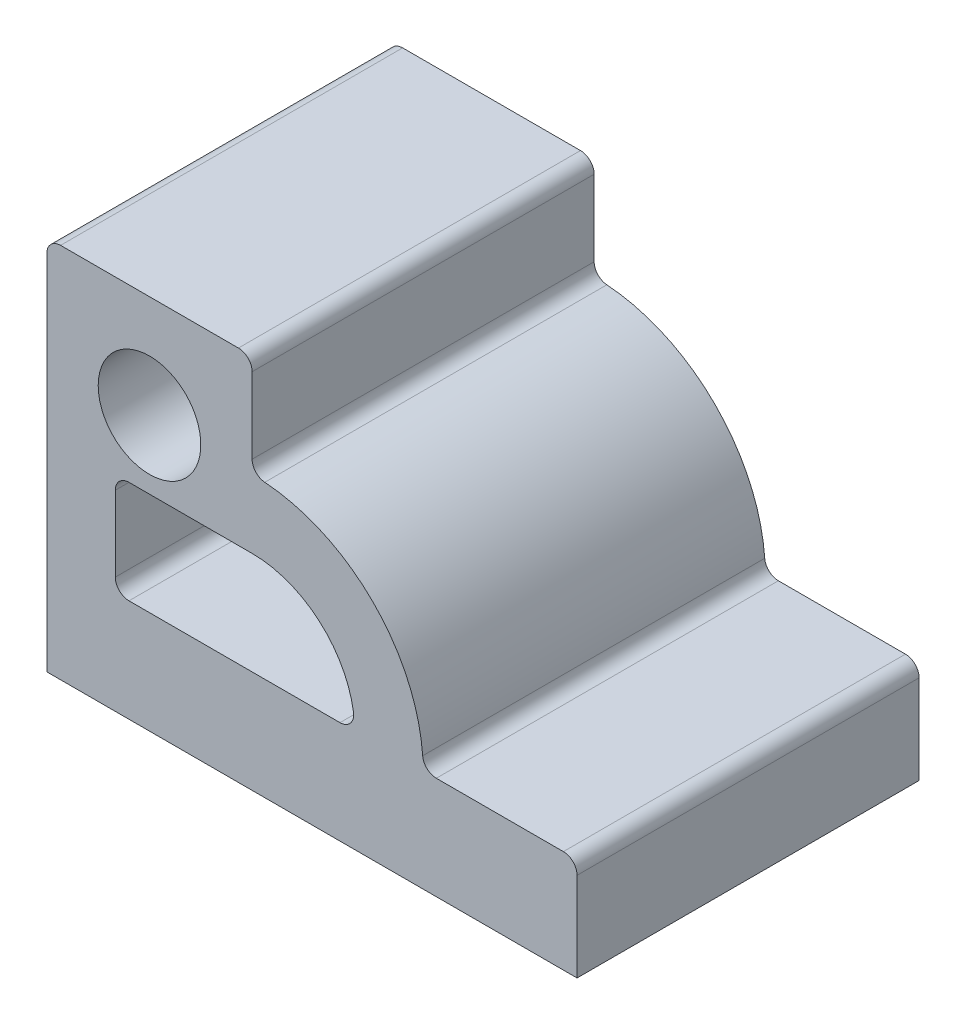
ISO-10303-21;
HEADER;
FILE_DESCRIPTION(('STEP AP214'),'2;1');
FILE_NAME('part.step','',(''),(''),'','','');
FILE_SCHEMA(('AUTOMOTIVE_DESIGN { 1 0 10303 214 1 1 1 1 }'));
ENDSEC;
DATA;
#1=APPLICATION_CONTEXT('core data for automotive mechanical design processes');
#2=APPLICATION_PROTOCOL_DEFINITION('international standard','automotive_design',2000,#1);
#3=PRODUCT_CONTEXT('',#1,'mechanical');
#4=PRODUCT('Part','Part','',(#3));
#5=PRODUCT_RELATED_PRODUCT_CATEGORY('part','',(#4));
#6=PRODUCT_DEFINITION_FORMATION('','',#4);
#7=PRODUCT_DEFINITION_CONTEXT('part definition',#1,'design');
#8=PRODUCT_DEFINITION('design','',#6,#7);
#9=PRODUCT_DEFINITION_SHAPE('','',#8);
#10=(LENGTH_UNIT() NAMED_UNIT(*) SI_UNIT(.MILLI.,.METRE.));
#11=(NAMED_UNIT(*) PLANE_ANGLE_UNIT() SI_UNIT($,.RADIAN.));
#12=(NAMED_UNIT(*) SI_UNIT($,.STERADIAN.) SOLID_ANGLE_UNIT());
#13=UNCERTAINTY_MEASURE_WITH_UNIT(LENGTH_MEASURE(1.E-05),#10,'distance_accuracy_value','');
#14=(GEOMETRIC_REPRESENTATION_CONTEXT(3) GLOBAL_UNCERTAINTY_ASSIGNED_CONTEXT((#13)) GLOBAL_UNIT_ASSIGNED_CONTEXT((#10,
#11,#12)) REPRESENTATION_CONTEXT('',''));
#15=CARTESIAN_POINT('',(0.,0.,0.));
#16=DIRECTION('',(0.,0.,1.));
#17=DIRECTION('',(1.,0.,0.));
#18=AXIS2_PLACEMENT_3D('',#15,#16,#17);
#19=CARTESIAN_POINT('',(-80.8657024793388,106.,100.));
#20=DIRECTION('',(0.,0.,-1.));
#21=DIRECTION('',(-1.,0.,0.));
#22=AXIS2_PLACEMENT_3D('',#19,#20,#21);
#23=PLANE('',#22);
#24=DIRECTION('',(0.,1.,0.));
#25=VECTOR('',#24,1.);
#26=CARTESIAN_POINT('',(70.1342975206612,26.,100.));
#27=LINE('',#26,#25);
#28=CARTESIAN_POINT('',(70.1342975206612,0.,100.));
#29=VERTEX_POINT('',#28);
#30=CARTESIAN_POINT('',(70.1342975206612,26.,100.));
#31=VERTEX_POINT('',#30);
#32=EDGE_CURVE('E229',#29,#31,#27,.T.);
#33=ORIENTED_EDGE('',*,*,#32,.T.);
#34=CARTESIAN_POINT('',(66.1342975206612,26.,100.));
#35=DIRECTION('',(0.,0.,1.));
#36=DIRECTION('',(-1.,0.,0.));
#37=AXIS2_PLACEMENT_3D('',#34,#35,#36);
#38=CIRCLE('',#37,4.);
#39=CARTESIAN_POINT('',(66.1342975206611,30.,100.));
#40=VERTEX_POINT('',#39);
#41=EDGE_CURVE('E232',#31,#40,#38,.T.);
#42=ORIENTED_EDGE('',*,*,#41,.T.);
#43=DIRECTION('',(-1.,0.,0.));
#44=VECTOR('',#43,1.);
#45=CARTESIAN_POINT('',(28.9859455920062,30.,100.));
#46=LINE('',#45,#44);
#47=CARTESIAN_POINT('',(28.9859455920062,30.,100.));
#48=VERTEX_POINT('',#47);
#49=EDGE_CURVE('E235',#40,#48,#46,.T.);
#50=ORIENTED_EDGE('',*,*,#49,.T.);
#51=CARTESIAN_POINT('',(28.9859455920062,34.,100.));
#52=DIRECTION('',(0.,0.,-1.));
#53=DIRECTION('',(1.,0.,0.));
#54=AXIS2_PLACEMENT_3D('',#51,#52,#53);
#55=CIRCLE('',#54,4.00000000000001);
#56=CARTESIAN_POINT('',(24.9969346237584,33.7037037037037,100.));
#57=VERTEX_POINT('',#56);
#58=EDGE_CURVE('E237',#48,#57,#55,.T.);
#59=ORIENTED_EDGE('',*,*,#58,.T.);
#60=CARTESIAN_POINT('',(-24.8657024793388,30.,100.));
#61=DIRECTION('',(0.,0.,1.));
#62=DIRECTION('',(-1.,0.,0.));
#63=AXIS2_PLACEMENT_3D('',#60,#61,#62);
#64=CIRCLE('',#63,50.);
#65=CARTESIAN_POINT('',(-21.1619987756351,79.8626371030973,100.));
#66=VERTEX_POINT('',#65);
#67=EDGE_CURVE('E239',#57,#66,#64,.T.);
#68=ORIENTED_EDGE('',*,*,#67,.T.);
#69=CARTESIAN_POINT('',(-20.8657024793388,83.851648071345,100.));
#70=DIRECTION('',(0.,0.,-1.));
#71=DIRECTION('',(1.,0.,0.));
#72=AXIS2_PLACEMENT_3D('',#69,#70,#71);
#73=CIRCLE('',#72,4.);
#74=CARTESIAN_POINT('',(-24.8657024793388,83.851648071345,100.));
#75=VERTEX_POINT('',#74);
#76=EDGE_CURVE('E241',#66,#75,#73,.T.);
#77=ORIENTED_EDGE('',*,*,#76,.T.);
#78=DIRECTION('',(0.,1.,0.));
#79=VECTOR('',#78,1.);
#80=CARTESIAN_POINT('',(-24.8657024793388,106.,100.));
#81=LINE('',#80,#79);
#82=CARTESIAN_POINT('',(-24.8657024793388,106.,100.));
#83=VERTEX_POINT('',#82);
#84=EDGE_CURVE('E243',#75,#83,#81,.T.);
#85=ORIENTED_EDGE('',*,*,#84,.T.);
#86=CARTESIAN_POINT('',(-28.8657024793388,106.,100.));
#87=DIRECTION('',(0.,0.,1.));
#88=DIRECTION('',(-1.,0.,0.));
#89=AXIS2_PLACEMENT_3D('',#86,#87,#88);
#90=CIRCLE('',#89,4.);
#91=CARTESIAN_POINT('',(-28.8657024793389,110.,100.));
#92=VERTEX_POINT('',#91);
#93=EDGE_CURVE('E245',#83,#92,#90,.T.);
#94=ORIENTED_EDGE('',*,*,#93,.T.);
#95=DIRECTION('',(-1.,0.,0.));
#96=VECTOR('',#95,1.);
#97=CARTESIAN_POINT('',(-80.8657024793388,110.,100.));
#98=LINE('',#97,#96);
#99=CARTESIAN_POINT('',(-80.8657024793388,110.,100.));
#100=VERTEX_POINT('',#99);
#101=EDGE_CURVE('E247',#92,#100,#98,.T.);
#102=ORIENTED_EDGE('',*,*,#101,.T.);
#103=CARTESIAN_POINT('',(-80.8657024793388,106.,100.));
#104=DIRECTION('',(0.,0.,1.));
#105=DIRECTION('',(-1.,0.,0.));
#106=AXIS2_PLACEMENT_3D('',#103,#104,#105);
#107=CIRCLE('',#106,4.);
#108=CARTESIAN_POINT('',(-84.8657024793388,106.,100.));
#109=VERTEX_POINT('',#108);
#110=EDGE_CURVE('E249',#100,#109,#107,.T.);
#111=ORIENTED_EDGE('',*,*,#110,.T.);
#112=DIRECTION('',(0.,-1.,0.));
#113=VECTOR('',#112,1.);
#114=CARTESIAN_POINT('',(-84.8657024793388,0.,100.));
#115=LINE('',#114,#113);
#116=CARTESIAN_POINT('',(-84.8657024793388,0.,100.));
#117=VERTEX_POINT('',#116);
#118=EDGE_CURVE('E251',#109,#117,#115,.T.);
#119=ORIENTED_EDGE('',*,*,#118,.T.);
#120=DIRECTION('',(1.,0.,0.));
#121=VECTOR('',#120,1.);
#122=CARTESIAN_POINT('',(70.1342975206612,0.,100.));
#123=LINE('',#122,#121);
#124=EDGE_CURVE('E253',#117,#29,#123,.T.);
#125=ORIENTED_EDGE('',*,*,#124,.T.);
#126=EDGE_LOOP('',(#33,#42,#50,#59,#68,#77,#85,#94,#102,#111,#119,#125));
#127=FACE_BOUND('',#126,.T.);
#128=CARTESIAN_POINT('',(-24.8657024793388,30.,100.));
#129=DIRECTION('',(0.,0.,1.));
#130=DIRECTION('',(-1.,0.,0.));
#131=AXIS2_PLACEMENT_3D('',#128,#129,#130);
#132=CIRCLE('',#131,30.);
#133=CARTESIAN_POINT('',(4.77714193296532,34.6153846153846,100.));
#134=VERTEX_POINT('',#133);
#135=CARTESIAN_POINT('',(-24.8657024793388,60.,100.));
#136=VERTEX_POINT('',#135);
#137=EDGE_CURVE('E168',#134,#136,#132,.T.);
#138=ORIENTED_EDGE('',*,*,#137,.F.);
#139=CARTESIAN_POINT('',(0.82476267799144,34.,100.));
#140=DIRECTION('',(0.,0.,1.));
#141=DIRECTION('',(1.,0.,0.));
#142=AXIS2_PLACEMENT_3D('',#139,#140,#141);
#143=CIRCLE('',#142,4.);
#144=CARTESIAN_POINT('',(0.824762677991441,30.,100.));
#145=VERTEX_POINT('',#144);
#146=EDGE_CURVE('E201',#145,#134,#143,.T.);
#147=ORIENTED_EDGE('',*,*,#146,.F.);
#148=DIRECTION('',(1.,0.,0.));
#149=VECTOR('',#148,1.);
#150=CARTESIAN_POINT('',(0.824762677991441,30.,100.));
#151=LINE('',#150,#149);
#152=CARTESIAN_POINT('',(-60.8657024793388,30.,100.));
#153=VERTEX_POINT('',#152);
#154=EDGE_CURVE('E199',#153,#145,#151,.T.);
#155=ORIENTED_EDGE('',*,*,#154,.F.);
#156=CARTESIAN_POINT('',(-60.8657024793388,34.,100.));
#157=DIRECTION('',(0.,0.,1.));
#158=DIRECTION('',(-1.,0.,0.));
#159=AXIS2_PLACEMENT_3D('',#156,#157,#158);
#160=CIRCLE('',#159,4.);
#161=CARTESIAN_POINT('',(-64.8657024793388,34.,100.));
#162=VERTEX_POINT('',#161);
#163=EDGE_CURVE('E197',#162,#153,#160,.T.);
#164=ORIENTED_EDGE('',*,*,#163,.F.);
#165=DIRECTION('',(0.,-1.,0.));
#166=VECTOR('',#165,1.);
#167=CARTESIAN_POINT('',(-64.8657024793388,34.,100.));
#168=LINE('',#167,#166);
#169=CARTESIAN_POINT('',(-64.8657024793388,56.,100.));
#170=VERTEX_POINT('',#169);
#171=EDGE_CURVE('E192',#170,#162,#168,.T.);
#172=ORIENTED_EDGE('',*,*,#171,.F.);
#173=CARTESIAN_POINT('',(-60.8657024793388,56.,100.));
#174=DIRECTION('',(0.,0.,1.));
#175=DIRECTION('',(-1.,0.,0.));
#176=AXIS2_PLACEMENT_3D('',#173,#174,#175);
#177=CIRCLE('',#176,4.);
#178=CARTESIAN_POINT('',(-60.8657024793388,60.,100.));
#179=VERTEX_POINT('',#178);
#180=EDGE_CURVE('E190',#179,#170,#177,.T.);
#181=ORIENTED_EDGE('',*,*,#180,.F.);
#182=DIRECTION('',(-1.,0.,0.));
#183=VECTOR('',#182,1.);
#184=CARTESIAN_POINT('',(-60.8657024793388,60.,100.));
#185=LINE('',#184,#183);
#186=EDGE_CURVE('E176',#136,#179,#185,.T.);
#187=ORIENTED_EDGE('',*,*,#186,.F.);
#188=EDGE_LOOP('',(#138,#147,#155,#164,#172,#181,#187));
#189=FACE_BOUND('',#188,.T.);
#190=CARTESIAN_POINT('',(-54.8657024793388,80.,100.));
#191=DIRECTION('',(0.,0.,1.));
#192=DIRECTION('',(1.,0.,0.));
#193=AXIS2_PLACEMENT_3D('',#190,#191,#192);
#194=CIRCLE('',#193,15.);
#195=CARTESIAN_POINT('',(-69.8657024793388,80.,100.));
#196=VERTEX_POINT('',#195);
#197=EDGE_CURVE('E204',#196,#196,#194,.T.);
#198=ORIENTED_EDGE('',*,*,#197,.F.);
#199=EDGE_LOOP('',(#198));
#200=FACE_BOUND('',#199,.T.);
#201=ADVANCED_FACE('F37',(#127,#189,#200),#23,.F.);
#202=CARTESIAN_POINT('',(-80.8657024793388,106.,0.));
#203=DIRECTION('',(0.,0.,-1.));
#204=DIRECTION('',(-1.,0.,0.));
#205=AXIS2_PLACEMENT_3D('',#202,#203,#204);
#206=PLANE('',#205);
#207=CARTESIAN_POINT('',(0.82476267799144,34.,0.));
#208=DIRECTION('',(0.,0.,1.));
#209=DIRECTION('',(1.,0.,0.));
#210=AXIS2_PLACEMENT_3D('',#207,#208,#209);
#211=CIRCLE('',#210,4.);
#212=CARTESIAN_POINT('',(0.824762677991441,30.,0.));
#213=VERTEX_POINT('',#212);
#214=CARTESIAN_POINT('',(4.77714193296532,34.6153846153846,0.));
#215=VERTEX_POINT('',#214);
#216=EDGE_CURVE('E177',#213,#215,#211,.T.);
#217=ORIENTED_EDGE('',*,*,#216,.T.);
#218=CARTESIAN_POINT('',(-24.8657024793388,30.,0.));
#219=DIRECTION('',(0.,0.,1.));
#220=DIRECTION('',(-1.,0.,0.));
#221=AXIS2_PLACEMENT_3D('',#218,#219,#220);
#222=CIRCLE('',#221,30.);
#223=CARTESIAN_POINT('',(-24.8657024793388,60.,0.));
#224=VERTEX_POINT('',#223);
#225=EDGE_CURVE('E60',#215,#224,#222,.T.);
#226=ORIENTED_EDGE('',*,*,#225,.T.);
#227=DIRECTION('',(-1.,0.,0.));
#228=VECTOR('',#227,1.);
#229=CARTESIAN_POINT('',(-60.8657024793388,60.,0.));
#230=LINE('',#229,#228);
#231=CARTESIAN_POINT('',(-60.8657024793388,60.,0.));
#232=VERTEX_POINT('',#231);
#233=EDGE_CURVE('E183',#224,#232,#230,.T.);
#234=ORIENTED_EDGE('',*,*,#233,.T.);
#235=CARTESIAN_POINT('',(-60.8657024793388,56.,0.));
#236=DIRECTION('',(0.,0.,1.));
#237=DIRECTION('',(-1.,0.,0.));
#238=AXIS2_PLACEMENT_3D('',#235,#236,#237);
#239=CIRCLE('',#238,4.);
#240=CARTESIAN_POINT('',(-64.8657024793388,56.,0.));
#241=VERTEX_POINT('',#240);
#242=EDGE_CURVE('E206',#232,#241,#239,.T.);
#243=ORIENTED_EDGE('',*,*,#242,.T.);
#244=DIRECTION('',(0.,-1.,0.));
#245=VECTOR('',#244,1.);
#246=CARTESIAN_POINT('',(-64.8657024793388,34.,0.));
#247=LINE('',#246,#245);
#248=CARTESIAN_POINT('',(-64.8657024793388,34.,0.));
#249=VERTEX_POINT('',#248);
#250=EDGE_CURVE('E209',#241,#249,#247,.T.);
#251=ORIENTED_EDGE('',*,*,#250,.T.);
#252=CARTESIAN_POINT('',(-60.8657024793388,34.,0.));
#253=DIRECTION('',(0.,0.,1.));
#254=DIRECTION('',(-1.,0.,0.));
#255=AXIS2_PLACEMENT_3D('',#252,#253,#254);
#256=CIRCLE('',#255,4.);
#257=CARTESIAN_POINT('',(-60.8657024793388,30.,0.));
#258=VERTEX_POINT('',#257);
#259=EDGE_CURVE('E212',#249,#258,#256,.T.);
#260=ORIENTED_EDGE('',*,*,#259,.T.);
#261=DIRECTION('',(1.,0.,0.));
#262=VECTOR('',#261,1.);
#263=CARTESIAN_POINT('',(0.824762677991441,30.,0.));
#264=LINE('',#263,#262);
#265=EDGE_CURVE('E215',#258,#213,#264,.T.);
#266=ORIENTED_EDGE('',*,*,#265,.T.);
#267=EDGE_LOOP('',(#217,#226,#234,#243,#251,#260,#266));
#268=FACE_BOUND('',#267,.T.);
#269=DIRECTION('',(0.,1.,0.));
#270=VECTOR('',#269,1.);
#271=CARTESIAN_POINT('',(70.1342975206612,26.,0.));
#272=LINE('',#271,#270);
#273=CARTESIAN_POINT('',(70.1342975206612,0.,0.));
#274=VERTEX_POINT('',#273);
#275=CARTESIAN_POINT('',(70.1342975206612,26.,0.));
#276=VERTEX_POINT('',#275);
#277=EDGE_CURVE('E184',#274,#276,#272,.T.);
#278=ORIENTED_EDGE('',*,*,#277,.F.);
#279=DIRECTION('',(1.,0.,0.));
#280=VECTOR('',#279,1.);
#281=CARTESIAN_POINT('',(70.1342975206612,0.,0.));
#282=LINE('',#281,#280);
#283=CARTESIAN_POINT('',(-84.8657024793388,0.,0.));
#284=VERTEX_POINT('',#283);
#285=EDGE_CURVE('E233',#284,#274,#282,.T.);
#286=ORIENTED_EDGE('',*,*,#285,.F.);
#287=DIRECTION('',(0.,-1.,0.));
#288=VECTOR('',#287,1.);
#289=CARTESIAN_POINT('',(-84.8657024793388,0.,0.));
#290=LINE('',#289,#288);
#291=CARTESIAN_POINT('',(-84.8657024793388,106.,0.));
#292=VERTEX_POINT('',#291);
#293=EDGE_CURVE('E276',#292,#284,#290,.T.);
#294=ORIENTED_EDGE('',*,*,#293,.F.);
#295=CARTESIAN_POINT('',(-80.8657024793388,106.,0.));
#296=DIRECTION('',(0.,0.,1.));
#297=DIRECTION('',(-1.,0.,0.));
#298=AXIS2_PLACEMENT_3D('',#295,#296,#297);
#299=CIRCLE('',#298,4.);
#300=CARTESIAN_POINT('',(-80.8657024793388,110.,0.));
#301=VERTEX_POINT('',#300);
#302=EDGE_CURVE('E274',#301,#292,#299,.T.);
#303=ORIENTED_EDGE('',*,*,#302,.F.);
#304=DIRECTION('',(-1.,0.,0.));
#305=VECTOR('',#304,1.);
#306=CARTESIAN_POINT('',(-80.8657024793388,110.,0.));
#307=LINE('',#306,#305);
#308=CARTESIAN_POINT('',(-28.8657024793389,110.,0.));
#309=VERTEX_POINT('',#308);
#310=EDGE_CURVE('E272',#309,#301,#307,.T.);
#311=ORIENTED_EDGE('',*,*,#310,.F.);
#312=CARTESIAN_POINT('',(-28.8657024793388,106.,0.));
#313=DIRECTION('',(0.,0.,1.));
#314=DIRECTION('',(-1.,0.,0.));
#315=AXIS2_PLACEMENT_3D('',#312,#313,#314);
#316=CIRCLE('',#315,4.);
#317=CARTESIAN_POINT('',(-24.8657024793388,106.,0.));
#318=VERTEX_POINT('',#317);
#319=EDGE_CURVE('E270',#318,#309,#316,.T.);
#320=ORIENTED_EDGE('',*,*,#319,.F.);
#321=DIRECTION('',(0.,1.,0.));
#322=VECTOR('',#321,1.);
#323=CARTESIAN_POINT('',(-24.8657024793388,106.,0.));
#324=LINE('',#323,#322);
#325=CARTESIAN_POINT('',(-24.8657024793388,83.851648071345,0.));
#326=VERTEX_POINT('',#325);
#327=EDGE_CURVE('E268',#326,#318,#324,.T.);
#328=ORIENTED_EDGE('',*,*,#327,.F.);
#329=CARTESIAN_POINT('',(-20.8657024793388,83.851648071345,0.));
#330=DIRECTION('',(0.,0.,-1.));
#331=DIRECTION('',(1.,0.,0.));
#332=AXIS2_PLACEMENT_3D('',#329,#330,#331);
#333=CIRCLE('',#332,4.);
#334=CARTESIAN_POINT('',(-21.1619987756351,79.8626371030973,0.));
#335=VERTEX_POINT('',#334);
#336=EDGE_CURVE('E266',#335,#326,#333,.T.);
#337=ORIENTED_EDGE('',*,*,#336,.F.);
#338=CARTESIAN_POINT('',(-24.8657024793388,30.,0.));
#339=DIRECTION('',(0.,0.,1.));
#340=DIRECTION('',(-1.,0.,0.));
#341=AXIS2_PLACEMENT_3D('',#338,#339,#340);
#342=CIRCLE('',#341,50.);
#343=CARTESIAN_POINT('',(24.9969346237584,33.7037037037037,0.));
#344=VERTEX_POINT('',#343);
#345=EDGE_CURVE('E264',#344,#335,#342,.T.);
#346=ORIENTED_EDGE('',*,*,#345,.F.);
#347=CARTESIAN_POINT('',(28.9859455920062,34.,0.));
#348=DIRECTION('',(0.,0.,-1.));
#349=DIRECTION('',(1.,0.,0.));
#350=AXIS2_PLACEMENT_3D('',#347,#348,#349);
#351=CIRCLE('',#350,4.00000000000001);
#352=CARTESIAN_POINT('',(28.9859455920062,30.,0.));
#353=VERTEX_POINT('',#352);
#354=EDGE_CURVE('E262',#353,#344,#351,.T.);
#355=ORIENTED_EDGE('',*,*,#354,.F.);
#356=DIRECTION('',(-1.,0.,0.));
#357=VECTOR('',#356,1.);
#358=CARTESIAN_POINT('',(28.9859455920062,30.,0.));
#359=LINE('',#358,#357);
#360=CARTESIAN_POINT('',(66.1342975206611,30.,0.));
#361=VERTEX_POINT('',#360);
#362=EDGE_CURVE('E260',#361,#353,#359,.T.);
#363=ORIENTED_EDGE('',*,*,#362,.F.);
#364=CARTESIAN_POINT('',(66.1342975206612,26.,0.));
#365=DIRECTION('',(0.,0.,1.));
#366=DIRECTION('',(-1.,0.,0.));
#367=AXIS2_PLACEMENT_3D('',#364,#365,#366);
#368=CIRCLE('',#367,4.);
#369=EDGE_CURVE('E258',#276,#361,#368,.T.);
#370=ORIENTED_EDGE('',*,*,#369,.F.);
#371=EDGE_LOOP('',(#278,#286,#294,#303,#311,#320,#328,#337,#346,#355,#363,#370));
#372=FACE_BOUND('',#371,.T.);
#373=CARTESIAN_POINT('',(-54.8657024793388,80.,0.));
#374=DIRECTION('',(0.,0.,1.));
#375=DIRECTION('',(1.,0.,0.));
#376=AXIS2_PLACEMENT_3D('',#373,#374,#375);
#377=CIRCLE('',#376,15.);
#378=CARTESIAN_POINT('',(-69.8657024793388,80.,0.));
#379=VERTEX_POINT('',#378);
#380=EDGE_CURVE('E604',#379,#379,#377,.T.);
#381=ORIENTED_EDGE('',*,*,#380,.T.);
#382=EDGE_LOOP('',(#381));
#383=FACE_BOUND('',#382,.T.);
#384=ADVANCED_FACE('F318',(#268,#372,#383),#206,.T.);
#385=CARTESIAN_POINT('',(70.1342975206612,26.,100.));
#386=DIRECTION('',(-1.,0.,0.));
#387=DIRECTION('',(0.,0.,1.));
#388=AXIS2_PLACEMENT_3D('',#385,#386,#387);
#389=PLANE('',#388);
#390=ORIENTED_EDGE('',*,*,#277,.T.);
#391=DIRECTION('',(0.,0.,-1.));
#392=VECTOR('',#391,1.);
#393=CARTESIAN_POINT('',(70.1342975206612,26.,100.));
#394=LINE('',#393,#392);
#395=EDGE_CURVE('E11',#31,#276,#394,.T.);
#396=ORIENTED_EDGE('',*,*,#395,.F.);
#397=ORIENTED_EDGE('',*,*,#32,.F.);
#398=DIRECTION('',(0.,0.,-1.));
#399=VECTOR('',#398,1.);
#400=CARTESIAN_POINT('',(70.1342975206612,0.,100.));
#401=LINE('',#400,#399);
#402=EDGE_CURVE('E255',#29,#274,#401,.T.);
#403=ORIENTED_EDGE('',*,*,#402,.T.);
#404=EDGE_LOOP('',(#390,#396,#397,#403));
#405=FACE_BOUND('',#404,.T.);
#406=ADVANCED_FACE('F39',(#405),#389,.F.);
#407=CARTESIAN_POINT('',(66.1342975206612,26.,100.));
#408=DIRECTION('',(0.,0.,-1.));
#409=DIRECTION('',(-1.,0.,0.));
#410=AXIS2_PLACEMENT_3D('',#407,#408,#409);
#411=CYLINDRICAL_SURFACE('',#410,4.);
#412=ORIENTED_EDGE('',*,*,#369,.T.);
#413=DIRECTION('',(0.,0.,-1.));
#414=VECTOR('',#413,1.);
#415=CARTESIAN_POINT('',(66.1342975206611,30.,100.));
#416=LINE('',#415,#414);
#417=EDGE_CURVE('E45',#40,#361,#416,.T.);
#418=ORIENTED_EDGE('',*,*,#417,.F.);
#419=ORIENTED_EDGE('',*,*,#41,.F.);
#420=ORIENTED_EDGE('',*,*,#395,.T.);
#421=EDGE_LOOP('',(#412,#418,#419,#420));
#422=FACE_BOUND('',#421,.T.);
#423=ADVANCED_FACE('F335',(#422),#411,.T.);
#424=CARTESIAN_POINT('',(28.9859455920062,30.,100.));
#425=DIRECTION('',(0.,-1.,0.));
#426=DIRECTION('',(1.,0.,0.));
#427=AXIS2_PLACEMENT_3D('',#424,#425,#426);
#428=PLANE('',#427);
#429=ORIENTED_EDGE('',*,*,#362,.T.);
#430=DIRECTION('',(0.,0.,-1.));
#431=VECTOR('',#430,1.);
#432=CARTESIAN_POINT('',(28.9859455920062,30.,100.));
#433=LINE('',#432,#431);
#434=EDGE_CURVE('E305',#48,#353,#433,.T.);
#435=ORIENTED_EDGE('',*,*,#434,.F.);
#436=ORIENTED_EDGE('',*,*,#49,.F.);
#437=ORIENTED_EDGE('',*,*,#417,.T.);
#438=EDGE_LOOP('',(#429,#435,#436,#437));
#439=FACE_BOUND('',#438,.T.);
#440=ADVANCED_FACE('F312',(#439),#428,.F.);
#441=CARTESIAN_POINT('',(28.9859455920062,34.,100.));
#442=DIRECTION('',(0.,0.,-1.));
#443=DIRECTION('',(-1.,0.,0.));
#444=AXIS2_PLACEMENT_3D('',#441,#442,#443);
#445=CYLINDRICAL_SURFACE('',#444,4.00000000000001);
#446=ORIENTED_EDGE('',*,*,#354,.T.);
#447=DIRECTION('',(0.,0.,-1.));
#448=VECTOR('',#447,1.);
#449=CARTESIAN_POINT('',(24.9969346237584,33.7037037037037,100.));
#450=LINE('',#449,#448);
#451=EDGE_CURVE('E302',#57,#344,#450,.T.);
#452=ORIENTED_EDGE('',*,*,#451,.F.);
#453=ORIENTED_EDGE('',*,*,#58,.F.);
#454=ORIENTED_EDGE('',*,*,#434,.T.);
#455=EDGE_LOOP('',(#446,#452,#453,#454));
#456=FACE_BOUND('',#455,.T.);
#457=ADVANCED_FACE('F324',(#456),#445,.F.);
#458=CARTESIAN_POINT('',(-24.8657024793388,30.,100.));
#459=DIRECTION('',(0.,0.,-1.));
#460=DIRECTION('',(-1.,0.,0.));
#461=AXIS2_PLACEMENT_3D('',#458,#459,#460);
#462=CYLINDRICAL_SURFACE('',#461,50.);
#463=ORIENTED_EDGE('',*,*,#345,.T.);
#464=DIRECTION('',(0.,0.,-1.));
#465=VECTOR('',#464,1.);
#466=CARTESIAN_POINT('',(-21.1619987756351,79.8626371030973,100.));
#467=LINE('',#466,#465);
#468=EDGE_CURVE('E299',#66,#335,#467,.T.);
#469=ORIENTED_EDGE('',*,*,#468,.F.);
#470=ORIENTED_EDGE('',*,*,#67,.F.);
#471=ORIENTED_EDGE('',*,*,#451,.T.);
#472=EDGE_LOOP('',(#463,#469,#470,#471));
#473=FACE_BOUND('',#472,.T.);
#474=ADVANCED_FACE('F328',(#473),#462,.T.);
#475=CARTESIAN_POINT('',(-20.8657024793388,83.851648071345,100.));
#476=DIRECTION('',(0.,0.,-1.));
#477=DIRECTION('',(-1.,0.,0.));
#478=AXIS2_PLACEMENT_3D('',#475,#476,#477);
#479=CYLINDRICAL_SURFACE('',#478,4.);
#480=ORIENTED_EDGE('',*,*,#336,.T.);
#481=DIRECTION('',(0.,0.,-1.));
#482=VECTOR('',#481,1.);
#483=CARTESIAN_POINT('',(-24.8657024793388,83.851648071345,100.));
#484=LINE('',#483,#482);
#485=EDGE_CURVE('E296',#75,#326,#484,.T.);
#486=ORIENTED_EDGE('',*,*,#485,.F.);
#487=ORIENTED_EDGE('',*,*,#76,.F.);
#488=ORIENTED_EDGE('',*,*,#468,.T.);
#489=EDGE_LOOP('',(#480,#486,#487,#488));
#490=FACE_BOUND('',#489,.T.);
#491=ADVANCED_FACE('F368',(#490),#479,.F.);
#492=CARTESIAN_POINT('',(-24.8657024793388,106.,100.));
#493=DIRECTION('',(-1.,0.,0.));
#494=DIRECTION('',(0.,0.,1.));
#495=AXIS2_PLACEMENT_3D('',#492,#493,#494);
#496=PLANE('',#495);
#497=ORIENTED_EDGE('',*,*,#327,.T.);
#498=DIRECTION('',(0.,0.,-1.));
#499=VECTOR('',#498,1.);
#500=CARTESIAN_POINT('',(-24.8657024793388,106.,100.));
#501=LINE('',#500,#499);
#502=EDGE_CURVE('E293',#83,#318,#501,.T.);
#503=ORIENTED_EDGE('',*,*,#502,.F.);
#504=ORIENTED_EDGE('',*,*,#84,.F.);
#505=ORIENTED_EDGE('',*,*,#485,.T.);
#506=EDGE_LOOP('',(#497,#503,#504,#505));
#507=FACE_BOUND('',#506,.T.);
#508=ADVANCED_FACE('F366',(#507),#496,.F.);
#509=CARTESIAN_POINT('',(-28.8657024793388,106.,100.));
#510=DIRECTION('',(0.,0.,-1.));
#511=DIRECTION('',(-1.,0.,0.));
#512=AXIS2_PLACEMENT_3D('',#509,#510,#511);
#513=CYLINDRICAL_SURFACE('',#512,4.);
#514=ORIENTED_EDGE('',*,*,#319,.T.);
#515=DIRECTION('',(0.,0.,-1.));
#516=VECTOR('',#515,1.);
#517=CARTESIAN_POINT('',(-28.8657024793389,110.,100.));
#518=LINE('',#517,#516);
#519=EDGE_CURVE('E290',#92,#309,#518,.T.);
#520=ORIENTED_EDGE('',*,*,#519,.F.);
#521=ORIENTED_EDGE('',*,*,#93,.F.);
#522=ORIENTED_EDGE('',*,*,#502,.T.);
#523=EDGE_LOOP('',(#514,#520,#521,#522));
#524=FACE_BOUND('',#523,.T.);
#525=ADVANCED_FACE('F362',(#524),#513,.T.);
#526=CARTESIAN_POINT('',(-80.8657024793388,110.,100.));
#527=DIRECTION('',(0.,-1.,0.));
#528=DIRECTION('',(0.,0.,-1.));
#529=AXIS2_PLACEMENT_3D('',#526,#527,#528);
#530=PLANE('',#529);
#531=ORIENTED_EDGE('',*,*,#310,.T.);
#532=DIRECTION('',(0.,0.,-1.));
#533=VECTOR('',#532,1.);
#534=CARTESIAN_POINT('',(-80.8657024793388,110.,100.));
#535=LINE('',#534,#533);
#536=EDGE_CURVE('E287',#100,#301,#535,.T.);
#537=ORIENTED_EDGE('',*,*,#536,.F.);
#538=ORIENTED_EDGE('',*,*,#101,.F.);
#539=ORIENTED_EDGE('',*,*,#519,.T.);
#540=EDGE_LOOP('',(#531,#537,#538,#539));
#541=FACE_BOUND('',#540,.T.);
#542=ADVANCED_FACE('F357',(#541),#530,.F.);
#543=CARTESIAN_POINT('',(-80.8657024793388,106.,100.));
#544=DIRECTION('',(0.,0.,-1.));
#545=DIRECTION('',(-1.,0.,0.));
#546=AXIS2_PLACEMENT_3D('',#543,#544,#545);
#547=CYLINDRICAL_SURFACE('',#546,4.);
#548=ORIENTED_EDGE('',*,*,#302,.T.);
#549=DIRECTION('',(0.,0.,-1.));
#550=VECTOR('',#549,1.);
#551=CARTESIAN_POINT('',(-84.8657024793388,106.,100.));
#552=LINE('',#551,#550);
#553=EDGE_CURVE('E284',#109,#292,#552,.T.);
#554=ORIENTED_EDGE('',*,*,#553,.F.);
#555=ORIENTED_EDGE('',*,*,#110,.F.);
#556=ORIENTED_EDGE('',*,*,#536,.T.);
#557=EDGE_LOOP('',(#548,#554,#555,#556));
#558=FACE_BOUND('',#557,.T.);
#559=ADVANCED_FACE('F351',(#558),#547,.T.);
#560=CARTESIAN_POINT('',(-84.8657024793388,0.,100.));
#561=DIRECTION('',(1.,0.,0.));
#562=DIRECTION('',(0.,0.,-1.));
#563=AXIS2_PLACEMENT_3D('',#560,#561,#562);
#564=PLANE('',#563);
#565=ORIENTED_EDGE('',*,*,#293,.T.);
#566=DIRECTION('',(0.,0.,-1.));
#567=VECTOR('',#566,1.);
#568=CARTESIAN_POINT('',(-84.8657024793388,0.,100.));
#569=LINE('',#568,#567);
#570=EDGE_CURVE('E281',#117,#284,#569,.T.);
#571=ORIENTED_EDGE('',*,*,#570,.F.);
#572=ORIENTED_EDGE('',*,*,#118,.F.);
#573=ORIENTED_EDGE('',*,*,#553,.T.);
#574=EDGE_LOOP('',(#565,#571,#572,#573));
#575=FACE_BOUND('',#574,.T.);
#576=ADVANCED_FACE('F347',(#575),#564,.F.);
#577=CARTESIAN_POINT('',(70.1342975206612,0.,100.));
#578=DIRECTION('',(0.,1.,0.));
#579=DIRECTION('',(0.,0.,1.));
#580=AXIS2_PLACEMENT_3D('',#577,#578,#579);
#581=PLANE('',#580);
#582=ORIENTED_EDGE('',*,*,#285,.T.);
#583=ORIENTED_EDGE('',*,*,#402,.F.);
#584=ORIENTED_EDGE('',*,*,#124,.F.);
#585=ORIENTED_EDGE('',*,*,#570,.T.);
#586=EDGE_LOOP('',(#582,#583,#584,#585));
#587=FACE_BOUND('',#586,.T.);
#588=ADVANCED_FACE('F342',(#587),#581,.F.);
#589=CARTESIAN_POINT('',(-24.8657024793388,30.,100.));
#590=DIRECTION('',(0.,0.,-1.));
#591=DIRECTION('',(-1.,0.,0.));
#592=AXIS2_PLACEMENT_3D('',#589,#590,#591);
#593=CYLINDRICAL_SURFACE('',#592,30.);
#594=ORIENTED_EDGE('',*,*,#225,.F.);
#595=DIRECTION('',(0.,0.,-1.));
#596=VECTOR('',#595,1.);
#597=CARTESIAN_POINT('',(4.77714193296532,34.6153846153846,100.));
#598=LINE('',#597,#596);
#599=EDGE_CURVE('E172',#134,#215,#598,.T.);
#600=ORIENTED_EDGE('',*,*,#599,.F.);
#601=ORIENTED_EDGE('',*,*,#137,.T.);
#602=DIRECTION('',(0.,0.,-1.));
#603=VECTOR('',#602,1.);
#604=CARTESIAN_POINT('',(-24.8657024793388,60.,100.));
#605=LINE('',#604,#603);
#606=EDGE_CURVE('E171',#136,#224,#605,.T.);
#607=ORIENTED_EDGE('',*,*,#606,.T.);
#608=EDGE_LOOP('',(#594,#600,#601,#607));
#609=FACE_BOUND('',#608,.T.);
#610=ADVANCED_FACE('F170',(#609),#593,.F.);
#611=CARTESIAN_POINT('',(-60.8657024793388,60.,100.));
#612=DIRECTION('',(0.,-1.,0.));
#613=DIRECTION('',(0.,0.,-1.));
#614=AXIS2_PLACEMENT_3D('',#611,#612,#613);
#615=PLANE('',#614);
#616=ORIENTED_EDGE('',*,*,#233,.F.);
#617=ORIENTED_EDGE('',*,*,#606,.F.);
#618=ORIENTED_EDGE('',*,*,#186,.T.);
#619=DIRECTION('',(0.,0.,-1.));
#620=VECTOR('',#619,1.);
#621=CARTESIAN_POINT('',(-60.8657024793388,60.,100.));
#622=LINE('',#621,#620);
#623=EDGE_CURVE('E185',#179,#232,#622,.T.);
#624=ORIENTED_EDGE('',*,*,#623,.T.);
#625=EDGE_LOOP('',(#616,#617,#618,#624));
#626=FACE_BOUND('',#625,.T.);
#627=ADVANCED_FACE('F180',(#626),#615,.T.);
#628=CARTESIAN_POINT('',(-60.8657024793388,56.,100.));
#629=DIRECTION('',(0.,0.,-1.));
#630=DIRECTION('',(-1.,0.,0.));
#631=AXIS2_PLACEMENT_3D('',#628,#629,#630);
#632=CYLINDRICAL_SURFACE('',#631,4.);
#633=ORIENTED_EDGE('',*,*,#242,.F.);
#634=ORIENTED_EDGE('',*,*,#623,.F.);
#635=ORIENTED_EDGE('',*,*,#180,.T.);
#636=DIRECTION('',(0.,0.,-1.));
#637=VECTOR('',#636,1.);
#638=CARTESIAN_POINT('',(-64.8657024793388,56.,100.));
#639=LINE('',#638,#637);
#640=EDGE_CURVE('E226',#170,#241,#639,.T.);
#641=ORIENTED_EDGE('',*,*,#640,.T.);
#642=EDGE_LOOP('',(#633,#634,#635,#641));
#643=FACE_BOUND('',#642,.T.);
#644=ADVANCED_FACE('F427',(#643),#632,.F.);
#645=CARTESIAN_POINT('',(-64.8657024793388,34.,100.));
#646=DIRECTION('',(1.,0.,0.));
#647=DIRECTION('',(0.,0.,-1.));
#648=AXIS2_PLACEMENT_3D('',#645,#646,#647);
#649=PLANE('',#648);
#650=ORIENTED_EDGE('',*,*,#250,.F.);
#651=ORIENTED_EDGE('',*,*,#640,.F.);
#652=ORIENTED_EDGE('',*,*,#171,.T.);
#653=DIRECTION('',(0.,0.,-1.));
#654=VECTOR('',#653,1.);
#655=CARTESIAN_POINT('',(-64.8657024793388,34.,100.));
#656=LINE('',#655,#654);
#657=EDGE_CURVE('E224',#162,#249,#656,.T.);
#658=ORIENTED_EDGE('',*,*,#657,.T.);
#659=EDGE_LOOP('',(#650,#651,#652,#658));
#660=FACE_BOUND('',#659,.T.);
#661=ADVANCED_FACE('F433',(#660),#649,.T.);
#662=CARTESIAN_POINT('',(-60.8657024793388,34.,100.));
#663=DIRECTION('',(0.,0.,-1.));
#664=DIRECTION('',(-1.,0.,0.));
#665=AXIS2_PLACEMENT_3D('',#662,#663,#664);
#666=CYLINDRICAL_SURFACE('',#665,4.);
#667=ORIENTED_EDGE('',*,*,#259,.F.);
#668=ORIENTED_EDGE('',*,*,#657,.F.);
#669=ORIENTED_EDGE('',*,*,#163,.T.);
#670=DIRECTION('',(0.,0.,-1.));
#671=VECTOR('',#670,1.);
#672=CARTESIAN_POINT('',(-60.8657024793388,30.,100.));
#673=LINE('',#672,#671);
#674=EDGE_CURVE('E222',#153,#258,#673,.T.);
#675=ORIENTED_EDGE('',*,*,#674,.T.);
#676=EDGE_LOOP('',(#667,#668,#669,#675));
#677=FACE_BOUND('',#676,.T.);
#678=ADVANCED_FACE('F441',(#677),#666,.F.);
#679=CARTESIAN_POINT('',(0.824762677991441,30.,100.));
#680=DIRECTION('',(0.,1.,0.));
#681=DIRECTION('',(-1.,0.,0.));
#682=AXIS2_PLACEMENT_3D('',#679,#680,#681);
#683=PLANE('',#682);
#684=ORIENTED_EDGE('',*,*,#265,.F.);
#685=ORIENTED_EDGE('',*,*,#674,.F.);
#686=ORIENTED_EDGE('',*,*,#154,.T.);
#687=DIRECTION('',(0.,0.,-1.));
#688=VECTOR('',#687,1.);
#689=CARTESIAN_POINT('',(0.824762677991441,30.,100.));
#690=LINE('',#689,#688);
#691=EDGE_CURVE('E52',#145,#213,#690,.T.);
#692=ORIENTED_EDGE('',*,*,#691,.T.);
#693=EDGE_LOOP('',(#684,#685,#686,#692));
#694=FACE_BOUND('',#693,.T.);
#695=ADVANCED_FACE('F449',(#694),#683,.T.);
#696=CARTESIAN_POINT('',(0.82476267799144,34.,100.));
#697=DIRECTION('',(0.,0.,-1.));
#698=DIRECTION('',(-1.,0.,0.));
#699=AXIS2_PLACEMENT_3D('',#696,#697,#698);
#700=CYLINDRICAL_SURFACE('',#699,4.);
#701=ORIENTED_EDGE('',*,*,#216,.F.);
#702=ORIENTED_EDGE('',*,*,#691,.F.);
#703=ORIENTED_EDGE('',*,*,#146,.T.);
#704=ORIENTED_EDGE('',*,*,#599,.T.);
#705=EDGE_LOOP('',(#701,#702,#703,#704));
#706=FACE_BOUND('',#705,.T.);
#707=ADVANCED_FACE('F457',(#706),#700,.F.);
#708=CARTESIAN_POINT('',(-54.8657024793388,80.,100.));
#709=DIRECTION('',(0.,0.,-1.));
#710=DIRECTION('',(-1.,0.,0.));
#711=AXIS2_PLACEMENT_3D('',#708,#709,#710);
#712=CYLINDRICAL_SURFACE('',#711,15.);
#713=CARTESIAN_POINT('',(-69.8657024793388,80.,100.));
#714=CARTESIAN_POINT('',(-69.8657024793388,80.,98.9583333333333));
#715=CARTESIAN_POINT('',(-69.8657024793388,80.,97.9166666666667));
#716=CARTESIAN_POINT('',(-69.8657024793388,80.,95.8333333333333));
#717=CARTESIAN_POINT('',(-69.8657024793388,80.,94.7916666666666));
#718=CARTESIAN_POINT('',(-69.8657024793388,80.,92.7083333333333));
#719=CARTESIAN_POINT('',(-69.8657024793388,80.,91.6666666666666));
#720=CARTESIAN_POINT('',(-69.8657024793388,80.,89.5833333333333));
#721=CARTESIAN_POINT('',(-69.8657024793388,80.,88.5416666666667));
#722=CARTESIAN_POINT('',(-69.8657024793388,80.,86.4583333333333));
#723=CARTESIAN_POINT('',(-69.8657024793388,80.,85.4166666666667));
#724=CARTESIAN_POINT('',(-69.8657024793388,80.,83.3333333333333));
#725=CARTESIAN_POINT('',(-69.8657024793388,80.,82.2916666666667));
#726=CARTESIAN_POINT('',(-69.8657024793388,80.,80.2083333333333));
#727=CARTESIAN_POINT('',(-69.8657024793388,80.,79.1666666666666));
#728=CARTESIAN_POINT('',(-69.8657024793388,80.,77.0833333333333));
#729=CARTESIAN_POINT('',(-69.8657024793388,80.,76.0416666666666));
#730=CARTESIAN_POINT('',(-69.8657024793388,80.,73.9583333333333));
#731=CARTESIAN_POINT('',(-69.8657024793388,80.,72.9166666666667));
#732=CARTESIAN_POINT('',(-69.8657024793388,80.,70.8333333333333));
#733=CARTESIAN_POINT('',(-69.8657024793388,80.,69.7916666666667));
#734=CARTESIAN_POINT('',(-69.8657024793388,80.,67.7083333333333));
#735=CARTESIAN_POINT('',(-69.8657024793388,80.,66.6666666666667));
#736=CARTESIAN_POINT('',(-69.8657024793388,80.,64.5833333333333));
#737=CARTESIAN_POINT('',(-69.8657024793388,80.,63.5416666666667));
#738=CARTESIAN_POINT('',(-69.8657024793388,80.,61.4583333333333));
#739=CARTESIAN_POINT('',(-69.8657024793388,80.,60.4166666666667));
#740=CARTESIAN_POINT('',(-69.8657024793388,80.,58.3333333333333));
#741=CARTESIAN_POINT('',(-69.8657024793388,80.,57.2916666666667));
#742=CARTESIAN_POINT('',(-69.8657024793388,80.,55.2083333333333));
#743=CARTESIAN_POINT('',(-69.8657024793388,80.,54.1666666666667));
#744=CARTESIAN_POINT('',(-69.8657024793388,80.,52.0833333333333));
#745=CARTESIAN_POINT('',(-69.8657024793388,80.,51.0416666666667));
#746=CARTESIAN_POINT('',(-69.8657024793388,80.,48.9583333333333));
#747=CARTESIAN_POINT('',(-69.8657024793388,80.,47.9166666666667));
#748=CARTESIAN_POINT('',(-69.8657024793388,80.,45.8333333333333));
#749=CARTESIAN_POINT('',(-69.8657024793388,80.,44.7916666666667));
#750=CARTESIAN_POINT('',(-69.8657024793388,80.,42.7083333333333));
#751=CARTESIAN_POINT('',(-69.8657024793388,80.,41.6666666666667));
#752=CARTESIAN_POINT('',(-69.8657024793388,80.,39.5833333333333));
#753=CARTESIAN_POINT('',(-69.8657024793388,80.,38.5416666666667));
#754=CARTESIAN_POINT('',(-69.8657024793388,80.,36.4583333333333));
#755=CARTESIAN_POINT('',(-69.8657024793388,80.,35.4166666666667));
#756=CARTESIAN_POINT('',(-69.8657024793388,80.,33.3333333333333));
#757=CARTESIAN_POINT('',(-69.8657024793388,80.,32.2916666666667));
#758=CARTESIAN_POINT('',(-69.8657024793388,80.,30.2083333333333));
#759=CARTESIAN_POINT('',(-69.8657024793388,80.,29.1666666666667));
#760=CARTESIAN_POINT('',(-69.8657024793388,80.,27.0833333333333));
#761=CARTESIAN_POINT('',(-69.8657024793388,80.,26.0416666666667));
#762=CARTESIAN_POINT('',(-69.8657024793388,80.,23.9583333333333));
#763=CARTESIAN_POINT('',(-69.8657024793388,80.,22.9166666666667));
#764=CARTESIAN_POINT('',(-69.8657024793388,80.,20.8333333333333));
#765=CARTESIAN_POINT('',(-69.8657024793388,80.,19.7916666666667));
#766=CARTESIAN_POINT('',(-69.8657024793388,80.,17.7083333333333));
#767=CARTESIAN_POINT('',(-69.8657024793388,80.,16.6666666666667));
#768=CARTESIAN_POINT('',(-69.8657024793388,80.,14.5833333333333));
#769=CARTESIAN_POINT('',(-69.8657024793388,80.,13.5416666666667));
#770=CARTESIAN_POINT('',(-69.8657024793388,80.,11.4583333333333));
#771=CARTESIAN_POINT('',(-69.8657024793388,80.,10.4166666666667));
#772=CARTESIAN_POINT('',(-69.8657024793388,80.,8.33333333333333));
#773=CARTESIAN_POINT('',(-69.8657024793388,80.,7.29166666666667));
#774=CARTESIAN_POINT('',(-69.8657024793388,80.,5.20833333333334));
#775=CARTESIAN_POINT('',(-69.8657024793388,80.,4.16666666666667));
#776=CARTESIAN_POINT('',(-69.8657024793388,80.,2.08333333333334));
#777=CARTESIAN_POINT('',(-69.8657024793388,80.,1.04166666666667));
#778=CARTESIAN_POINT('',(-69.8657024793388,80.,0.));
#779=B_SPLINE_CURVE_WITH_KNOTS('',3,(#713,#714,#715,#716,#717,#718,#719,#720,#721,#722,#723,
#724,#725,#726,#727,#728,#729,#730,#731,#732,#733,#734,#735,#736,#737,#738,#739,#740,#741,#742,
#743,#744,#745,#746,#747,#748,#749,#750,#751,#752,#753,#754,#755,#756,#757,#758,#759,#760,#761,
#762,#763,#764,#765,#766,#767,#768,#769,#770,#771,#772,#773,#774,#775,#776,#777,#778),
.UNSPECIFIED.,.F.,.F.,(4,2,2,2,2,2,2,2,2,2,2,2,2,2,2,2,2,2,2,2,2,2,2,2,2,2,2,2,2,2,2,2,4),(0.,
3.12499999999999,6.24999999999999,9.37499999999999,12.5,15.625,18.75,21.875,25.,28.125,31.25,
34.375,37.5,40.625,43.75,46.875,50.,53.125,56.25,59.375,62.5,65.625,68.75,71.875,75.,78.125,
81.25,84.375,87.5,90.625,93.75,96.875,100.),.UNSPECIFIED.);
#780=EDGE_CURVE('BSEAM465',#196,#379,#779,.T.);
#781=ORIENTED_EDGE('',*,*,#197,.T.);
#782=ORIENTED_EDGE('',*,*,#380,.F.);
#783=ORIENTED_EDGE('',*,*,#780,.T.);
#784=ORIENTED_EDGE('',*,*,#780,.F.);
#785=EDGE_LOOP('',(#781,#783,#782,#784));
#786=FACE_BOUND('',#785,.T.);
#787=ADVANCED_FACE('F465',(#786),#712,.F.);
#788=CLOSED_SHELL('',(#201,#384,#406,#423,#440,#457,#474,#491,#508,#525,#542,#559,#576,#588,
#610,#627,#644,#661,#678,#695,#707,#787));
#789=MANIFOLD_SOLID_BREP('B2',#788);
#790=ADVANCED_BREP_SHAPE_REPRESENTATION('',(#18,#789),#14);
#791=SHAPE_DEFINITION_REPRESENTATION(#9,#790);
ENDSEC;
END-ISO-10303-21;
